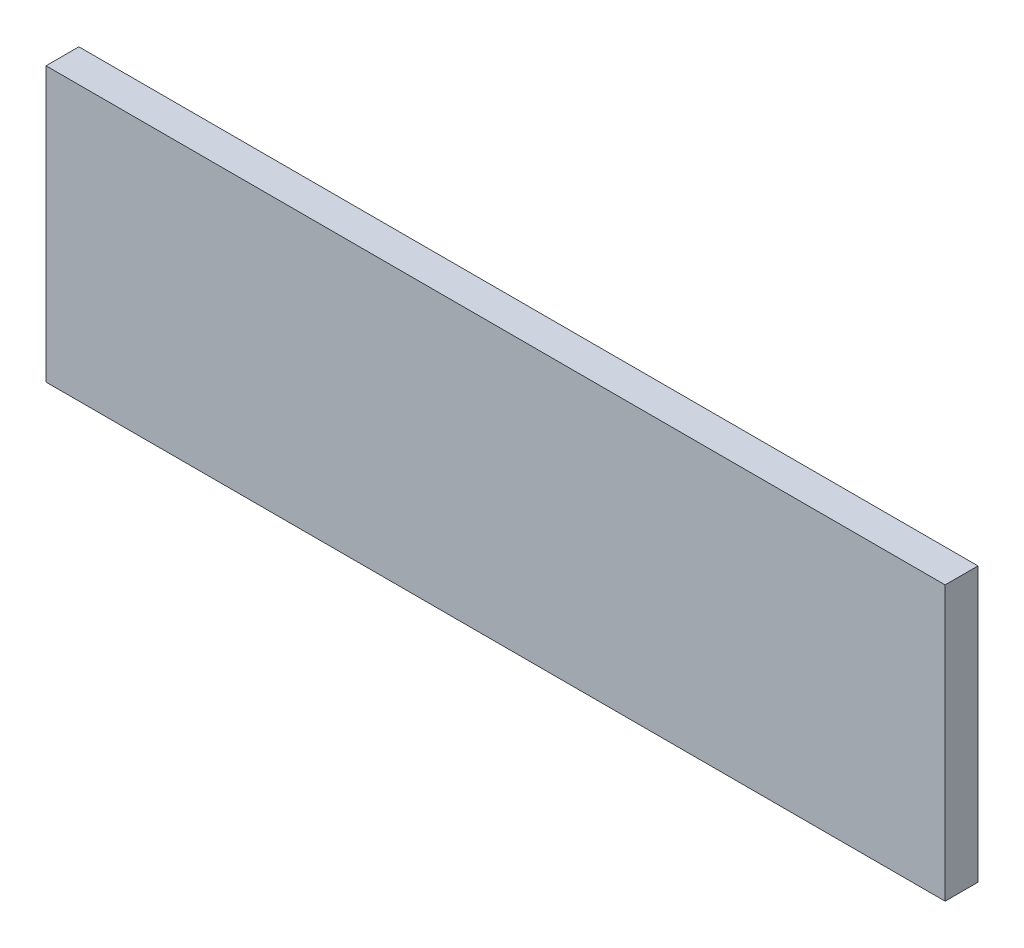
ISO-10303-21;
HEADER;
FILE_DESCRIPTION(('STEP AP214'),'2;1');
FILE_NAME('part.step','',(''),(''),'','','');
FILE_SCHEMA(('AUTOMOTIVE_DESIGN { 1 0 10303 214 1 1 1 1 }'));
ENDSEC;
DATA;
#1=APPLICATION_CONTEXT('core data for automotive mechanical design processes');
#2=APPLICATION_PROTOCOL_DEFINITION('international standard','automotive_design',2000,#1);
#3=PRODUCT_CONTEXT('',#1,'mechanical');
#4=PRODUCT('Part','Part','',(#3));
#5=PRODUCT_RELATED_PRODUCT_CATEGORY('part','',(#4));
#6=PRODUCT_DEFINITION_FORMATION('','',#4);
#7=PRODUCT_DEFINITION_CONTEXT('part definition',#1,'design');
#8=PRODUCT_DEFINITION('design','',#6,#7);
#9=PRODUCT_DEFINITION_SHAPE('','',#8);
#10=(LENGTH_UNIT() NAMED_UNIT(*) SI_UNIT(.MILLI.,.METRE.));
#11=(NAMED_UNIT(*) PLANE_ANGLE_UNIT() SI_UNIT($,.RADIAN.));
#12=(NAMED_UNIT(*) SI_UNIT($,.STERADIAN.) SOLID_ANGLE_UNIT());
#13=UNCERTAINTY_MEASURE_WITH_UNIT(LENGTH_MEASURE(1.E-05),#10,'distance_accuracy_value','');
#14=(GEOMETRIC_REPRESENTATION_CONTEXT(3) GLOBAL_UNCERTAINTY_ASSIGNED_CONTEXT((#13)) GLOBAL_UNIT_ASSIGNED_CONTEXT((#10,
#11,#12)) REPRESENTATION_CONTEXT('',''));
#15=CARTESIAN_POINT('',(0.,0.,0.));
#16=DIRECTION('',(0.,0.,1.));
#17=DIRECTION('',(1.,0.,0.));
#18=AXIS2_PLACEMENT_3D('',#15,#16,#17);
#19=CARTESIAN_POINT('',(-82.05,25.,6.));
#20=DIRECTION('',(1.,0.,0.));
#21=DIRECTION('',(0.,0.,-1.));
#22=AXIS2_PLACEMENT_3D('',#19,#20,#21);
#23=PLANE('',#22);
#24=DIRECTION('',(0.,-1.,0.));
#25=VECTOR('',#24,1.);
#26=CARTESIAN_POINT('',(-82.05,25.,0.));
#27=LINE('',#26,#25);
#28=CARTESIAN_POINT('',(-82.05,25.,0.));
#29=VERTEX_POINT('',#28);
#30=CARTESIAN_POINT('',(-82.05,-25.,0.));
#31=VERTEX_POINT('',#30);
#32=EDGE_CURVE('E104',#29,#31,#27,.T.);
#33=ORIENTED_EDGE('',*,*,#32,.T.);
#34=DIRECTION('',(0.,0.,-1.));
#35=VECTOR('',#34,1.);
#36=CARTESIAN_POINT('',(-82.05,-25.,6.));
#37=LINE('',#36,#35);
#38=CARTESIAN_POINT('',(-82.05,-25.,6.));
#39=VERTEX_POINT('',#38);
#40=EDGE_CURVE('E11',#39,#31,#37,.T.);
#41=ORIENTED_EDGE('',*,*,#40,.F.);
#42=DIRECTION('',(0.,-1.,0.));
#43=VECTOR('',#42,1.);
#44=CARTESIAN_POINT('',(-82.05,25.,6.));
#45=LINE('',#44,#43);
#46=CARTESIAN_POINT('',(-82.05,25.,6.));
#47=VERTEX_POINT('',#46);
#48=EDGE_CURVE('E92',#47,#39,#45,.T.);
#49=ORIENTED_EDGE('',*,*,#48,.F.);
#50=DIRECTION('',(0.,0.,-1.));
#51=VECTOR('',#50,1.);
#52=CARTESIAN_POINT('',(-82.05,25.,6.));
#53=LINE('',#52,#51);
#54=EDGE_CURVE('E100',#47,#29,#53,.T.);
#55=ORIENTED_EDGE('',*,*,#54,.T.);
#56=EDGE_LOOP('',(#33,#41,#49,#55));
#57=FACE_BOUND('',#56,.T.);
#58=ADVANCED_FACE('F41',(#57),#23,.F.);
#59=CARTESIAN_POINT('',(82.05,-25.,6.));
#60=DIRECTION('',(0.,1.,0.));
#61=DIRECTION('',(-1.,0.,0.));
#62=AXIS2_PLACEMENT_3D('',#59,#60,#61);
#63=PLANE('',#62);
#64=DIRECTION('',(1.,0.,0.));
#65=VECTOR('',#64,1.);
#66=CARTESIAN_POINT('',(82.05,-25.,0.));
#67=LINE('',#66,#65);
#68=CARTESIAN_POINT('',(82.05,-25.,0.));
#69=VERTEX_POINT('',#68);
#70=EDGE_CURVE('E96',#31,#69,#67,.T.);
#71=ORIENTED_EDGE('',*,*,#70,.T.);
#72=DIRECTION('',(0.,0.,-1.));
#73=VECTOR('',#72,1.);
#74=CARTESIAN_POINT('',(82.05,-25.,6.));
#75=LINE('',#74,#73);
#76=CARTESIAN_POINT('',(82.05,-25.,6.));
#77=VERTEX_POINT('',#76);
#78=EDGE_CURVE('E49',#77,#69,#75,.T.);
#79=ORIENTED_EDGE('',*,*,#78,.F.);
#80=DIRECTION('',(1.,0.,0.));
#81=VECTOR('',#80,1.);
#82=CARTESIAN_POINT('',(82.05,-25.,6.));
#83=LINE('',#82,#81);
#84=EDGE_CURVE('E87',#39,#77,#83,.T.);
#85=ORIENTED_EDGE('',*,*,#84,.F.);
#86=ORIENTED_EDGE('',*,*,#40,.T.);
#87=EDGE_LOOP('',(#71,#79,#85,#86));
#88=FACE_BOUND('',#87,.T.);
#89=ADVANCED_FACE('F95',(#88),#63,.F.);
#90=CARTESIAN_POINT('',(82.05,25.,6.));
#91=DIRECTION('',(-1.,0.,0.));
#92=DIRECTION('',(0.,-1.,0.));
#93=AXIS2_PLACEMENT_3D('',#90,#91,#92);
#94=PLANE('',#93);
#95=DIRECTION('',(0.,1.,0.));
#96=VECTOR('',#95,1.);
#97=CARTESIAN_POINT('',(82.05,25.,0.));
#98=LINE('',#97,#96);
#99=CARTESIAN_POINT('',(82.05,25.,0.));
#100=VERTEX_POINT('',#99);
#101=EDGE_CURVE('E74',#69,#100,#98,.T.);
#102=ORIENTED_EDGE('',*,*,#101,.T.);
#103=DIRECTION('',(0.,0.,-1.));
#104=VECTOR('',#103,1.);
#105=CARTESIAN_POINT('',(82.05,25.,6.));
#106=LINE('',#105,#104);
#107=CARTESIAN_POINT('',(82.05,25.,6.));
#108=VERTEX_POINT('',#107);
#109=EDGE_CURVE('E97',#108,#100,#106,.T.);
#110=ORIENTED_EDGE('',*,*,#109,.F.);
#111=DIRECTION('',(0.,1.,0.));
#112=VECTOR('',#111,1.);
#113=CARTESIAN_POINT('',(82.05,25.,6.));
#114=LINE('',#113,#112);
#115=EDGE_CURVE('E90',#77,#108,#114,.T.);
#116=ORIENTED_EDGE('',*,*,#115,.F.);
#117=ORIENTED_EDGE('',*,*,#78,.T.);
#118=EDGE_LOOP('',(#102,#110,#116,#117));
#119=FACE_BOUND('',#118,.T.);
#120=ADVANCED_FACE('F98',(#119),#94,.F.);
#121=CARTESIAN_POINT('',(82.05,25.,6.));
#122=DIRECTION('',(0.,-1.,0.));
#123=DIRECTION('',(1.,0.,0.));
#124=AXIS2_PLACEMENT_3D('',#121,#122,#123);
#125=PLANE('',#124);
#126=DIRECTION('',(-1.,0.,0.));
#127=VECTOR('',#126,1.);
#128=CARTESIAN_POINT('',(82.05,25.,0.));
#129=LINE('',#128,#127);
#130=EDGE_CURVE('E80',#100,#29,#129,.T.);
#131=ORIENTED_EDGE('',*,*,#130,.T.);
#132=ORIENTED_EDGE('',*,*,#54,.F.);
#133=DIRECTION('',(-1.,0.,0.));
#134=VECTOR('',#133,1.);
#135=CARTESIAN_POINT('',(82.05,25.,6.));
#136=LINE('',#135,#134);
#137=EDGE_CURVE('E57',#108,#47,#136,.T.);
#138=ORIENTED_EDGE('',*,*,#137,.F.);
#139=ORIENTED_EDGE('',*,*,#109,.T.);
#140=EDGE_LOOP('',(#131,#132,#138,#139));
#141=FACE_BOUND('',#140,.T.);
#142=ADVANCED_FACE('F111',(#141),#125,.F.);
#143=CARTESIAN_POINT('',(0.,0.,6.));
#144=DIRECTION('',(0.,0.,-1.));
#145=DIRECTION('',(-1.,0.,0.));
#146=AXIS2_PLACEMENT_3D('',#143,#144,#145);
#147=PLANE('',#146);
#148=ORIENTED_EDGE('',*,*,#48,.T.);
#149=ORIENTED_EDGE('',*,*,#84,.T.);
#150=ORIENTED_EDGE('',*,*,#115,.T.);
#151=ORIENTED_EDGE('',*,*,#137,.T.);
#152=EDGE_LOOP('',(#148,#149,#150,#151));
#153=FACE_BOUND('',#152,.T.);
#154=ADVANCED_FACE('F88',(#153),#147,.F.);
#155=CARTESIAN_POINT('',(0.,0.,0.));
#156=DIRECTION('',(0.,0.,-1.));
#157=DIRECTION('',(-1.,0.,0.));
#158=AXIS2_PLACEMENT_3D('',#155,#156,#157);
#159=PLANE('',#158);
#160=ORIENTED_EDGE('',*,*,#32,.F.);
#161=ORIENTED_EDGE('',*,*,#130,.F.);
#162=ORIENTED_EDGE('',*,*,#101,.F.);
#163=ORIENTED_EDGE('',*,*,#70,.F.);
#164=EDGE_LOOP('',(#160,#161,#162,#163));
#165=FACE_BOUND('',#164,.T.);
#166=ADVANCED_FACE('F114',(#165),#159,.T.);
#167=CLOSED_SHELL('',(#58,#89,#120,#142,#154,#166));
#168=MANIFOLD_SOLID_BREP('B2',#167);
#169=ADVANCED_BREP_SHAPE_REPRESENTATION('',(#18,#168),#14);
#170=SHAPE_DEFINITION_REPRESENTATION(#9,#169);
ENDSEC;
END-ISO-10303-21;
